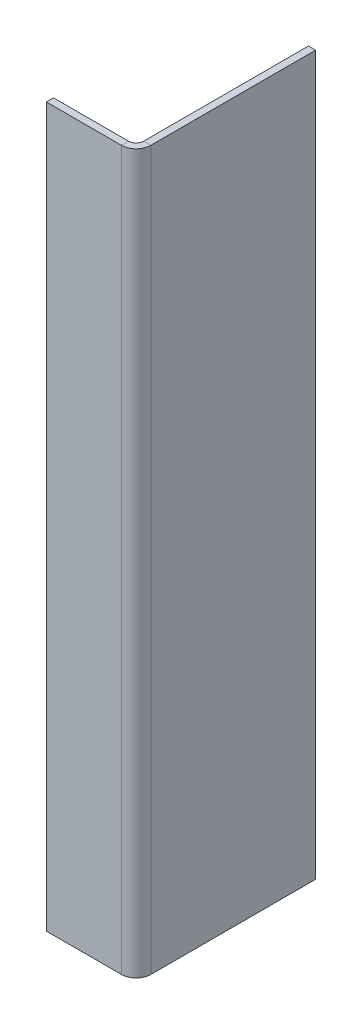
ISO-10303-21;
HEADER;
FILE_DESCRIPTION(('STEP AP214'),'2;1');
FILE_NAME('part.step','',(''),(''),'','','');
FILE_SCHEMA(('AUTOMOTIVE_DESIGN { 1 0 10303 214 1 1 1 1 }'));
ENDSEC;
DATA;
#1=APPLICATION_CONTEXT('core data for automotive mechanical design processes');
#2=APPLICATION_PROTOCOL_DEFINITION('international standard','automotive_design',2000,#1);
#3=PRODUCT_CONTEXT('',#1,'mechanical');
#4=PRODUCT('Part','Part','',(#3));
#5=PRODUCT_RELATED_PRODUCT_CATEGORY('part','',(#4));
#6=PRODUCT_DEFINITION_FORMATION('','',#4);
#7=PRODUCT_DEFINITION_CONTEXT('part definition',#1,'design');
#8=PRODUCT_DEFINITION('design','',#6,#7);
#9=PRODUCT_DEFINITION_SHAPE('','',#8);
#10=(LENGTH_UNIT() NAMED_UNIT(*) SI_UNIT(.MILLI.,.METRE.));
#11=(NAMED_UNIT(*) PLANE_ANGLE_UNIT() SI_UNIT($,.RADIAN.));
#12=(NAMED_UNIT(*) SI_UNIT($,.STERADIAN.) SOLID_ANGLE_UNIT());
#13=UNCERTAINTY_MEASURE_WITH_UNIT(LENGTH_MEASURE(1.E-05),#10,'distance_accuracy_value','');
#14=(GEOMETRIC_REPRESENTATION_CONTEXT(3) GLOBAL_UNCERTAINTY_ASSIGNED_CONTEXT((#13)) GLOBAL_UNIT_ASSIGNED_CONTEXT((#10,
#11,#12)) REPRESENTATION_CONTEXT('',''));
#15=CARTESIAN_POINT('',(0.,0.,0.));
#16=DIRECTION('',(0.,0.,1.));
#17=DIRECTION('',(1.,0.,0.));
#18=AXIS2_PLACEMENT_3D('',#15,#16,#17);
#19=CARTESIAN_POINT('',(-6.21284,152.4,38.1));
#20=DIRECTION('',(0.,1.,0.));
#21=DIRECTION('',(0.,0.,1.));
#22=AXIS2_PLACEMENT_3D('',#19,#20,#21);
#23=PLANE('',#22);
#24=DIRECTION('',(0.,0.,-1.));
#25=VECTOR('',#24,1.);
#26=CARTESIAN_POINT('',(-6.21284,152.4,38.1));
#27=LINE('',#26,#25);
#28=CARTESIAN_POINT('',(-6.21284,152.4,38.1));
#29=VERTEX_POINT('',#28);
#30=CARTESIAN_POINT('',(-6.21284,152.4,35.06216));
#31=VERTEX_POINT('',#30);
#32=EDGE_CURVE('E11',#29,#31,#27,.T.);
#33=ORIENTED_EDGE('',*,*,#32,.F.);
#34=CARTESIAN_POINT('',(-6.21284,152.4,31.88716));
#35=DIRECTION('',(0.,1.,0.));
#36=DIRECTION('',(0.,0.,1.));
#37=AXIS2_PLACEMENT_3D('',#34,#35,#36);
#38=CIRCLE('',#37,6.21284);
#39=CARTESIAN_POINT('',(0.,152.4,31.8871599999999));
#40=VERTEX_POINT('',#39);
#41=EDGE_CURVE('E136',#40,#29,#38,.F.);
#42=ORIENTED_EDGE('',*,*,#41,.F.);
#43=DIRECTION('',(1.,0.,0.));
#44=VECTOR('',#43,1.);
#45=CARTESIAN_POINT('',(-3.03784,152.4,31.88716));
#46=LINE('',#45,#44);
#47=CARTESIAN_POINT('',(-3.03784,152.4,31.88716));
#48=VERTEX_POINT('',#47);
#49=EDGE_CURVE('E47',#48,#40,#46,.T.);
#50=ORIENTED_EDGE('',*,*,#49,.F.);
#51=CARTESIAN_POINT('',(-6.21284,152.4,31.88716));
#52=DIRECTION('',(0.,1.,0.));
#53=DIRECTION('',(1.,0.,0.));
#54=AXIS2_PLACEMENT_3D('',#51,#52,#53);
#55=CIRCLE('',#54,3.175);
#56=EDGE_CURVE('E129',#48,#31,#55,.F.);
#57=ORIENTED_EDGE('',*,*,#56,.T.);
#58=EDGE_LOOP('',(#33,#42,#50,#57));
#59=FACE_BOUND('',#58,.T.);
#60=ADVANCED_FACE('F39',(#59),#23,.T.);
#61=CARTESIAN_POINT('',(-3.03784,152.4,31.88716));
#62=DIRECTION('',(0.,1.,0.));
#63=DIRECTION('',(0.,0.,1.));
#64=AXIS2_PLACEMENT_3D('',#61,#62,#63);
#65=PLANE('',#64);
#66=DIRECTION('',(-1.,0.,0.));
#67=VECTOR('',#66,1.);
#68=CARTESIAN_POINT('',(0.,152.4,38.1));
#69=LINE('',#68,#67);
#70=CARTESIAN_POINT('',(-38.1,152.4,38.1));
#71=VERTEX_POINT('',#70);
#72=EDGE_CURVE('E185',#29,#71,#69,.T.);
#73=ORIENTED_EDGE('',*,*,#72,.F.);
#74=ORIENTED_EDGE('',*,*,#32,.T.);
#75=DIRECTION('',(1.,0.,0.));
#76=VECTOR('',#75,1.);
#77=CARTESIAN_POINT('',(0.,152.4,35.06216));
#78=LINE('',#77,#76);
#79=CARTESIAN_POINT('',(-38.1,152.4,35.06216));
#80=VERTEX_POINT('',#79);
#81=EDGE_CURVE('E95',#31,#80,#78,.F.);
#82=ORIENTED_EDGE('',*,*,#81,.T.);
#83=DIRECTION('',(0.,0.,-1.));
#84=VECTOR('',#83,1.);
#85=CARTESIAN_POINT('',(-38.1,152.4,38.1));
#86=LINE('',#85,#84);
#87=EDGE_CURVE('E342',#71,#80,#86,.T.);
#88=ORIENTED_EDGE('',*,*,#87,.F.);
#89=EDGE_LOOP('',(#73,#74,#82,#88));
#90=FACE_BOUND('',#89,.T.);
#91=ADVANCED_FACE('F193',(#90),#65,.T.);
#92=CARTESIAN_POINT('',(0.,-152.4,31.8871599999999));
#93=DIRECTION('',(0.,-1.,0.));
#94=DIRECTION('',(0.,0.,-1.));
#95=AXIS2_PLACEMENT_3D('',#92,#93,#94);
#96=PLANE('',#95);
#97=DIRECTION('',(-1.,0.,0.));
#98=VECTOR('',#97,1.);
#99=CARTESIAN_POINT('',(0.,-152.4,31.8871599999999));
#100=LINE('',#99,#98);
#101=CARTESIAN_POINT('',(0.,-152.4,31.8871599999999));
#102=VERTEX_POINT('',#101);
#103=CARTESIAN_POINT('',(-3.03784,-152.4,31.88716));
#104=VERTEX_POINT('',#103);
#105=EDGE_CURVE('E82',#102,#104,#100,.T.);
#106=ORIENTED_EDGE('',*,*,#105,.F.);
#107=CARTESIAN_POINT('',(-6.21284,-152.4,31.88716));
#108=DIRECTION('',(0.,1.,0.));
#109=DIRECTION('',(0.,0.,1.));
#110=AXIS2_PLACEMENT_3D('',#107,#108,#109);
#111=CIRCLE('',#110,6.21284);
#112=CARTESIAN_POINT('',(-6.21284,-152.4,38.1));
#113=VERTEX_POINT('',#112);
#114=EDGE_CURVE('E151',#102,#113,#111,.F.);
#115=ORIENTED_EDGE('',*,*,#114,.T.);
#116=DIRECTION('',(0.,0.,1.));
#117=VECTOR('',#116,1.);
#118=CARTESIAN_POINT('',(-6.21284,-152.4,35.06216));
#119=LINE('',#118,#117);
#120=CARTESIAN_POINT('',(-6.21284,-152.4,35.06216));
#121=VERTEX_POINT('',#120);
#122=EDGE_CURVE('E89',#121,#113,#119,.T.);
#123=ORIENTED_EDGE('',*,*,#122,.F.);
#124=CARTESIAN_POINT('',(-6.21284,-152.4,31.88716));
#125=DIRECTION('',(0.,1.,0.));
#126=DIRECTION('',(1.,0.,0.));
#127=AXIS2_PLACEMENT_3D('',#124,#125,#126);
#128=CIRCLE('',#127,3.175);
#129=EDGE_CURVE('E158',#104,#121,#128,.F.);
#130=ORIENTED_EDGE('',*,*,#129,.F.);
#131=EDGE_LOOP('',(#106,#115,#123,#130));
#132=FACE_BOUND('',#131,.T.);
#133=ADVANCED_FACE('F191',(#132),#96,.T.);
#134=CARTESIAN_POINT('',(-6.21284,-152.4,35.06216));
#135=DIRECTION('',(0.,-1.,0.));
#136=DIRECTION('',(0.,0.,-1.));
#137=AXIS2_PLACEMENT_3D('',#134,#135,#136);
#138=PLANE('',#137);
#139=DIRECTION('',(0.,0.,1.));
#140=VECTOR('',#139,1.);
#141=CARTESIAN_POINT('',(0.,-152.4,-38.1));
#142=LINE('',#141,#140);
#143=CARTESIAN_POINT('',(0.,-152.4,-38.1));
#144=VERTEX_POINT('',#143);
#145=EDGE_CURVE('E153',#144,#102,#142,.T.);
#146=ORIENTED_EDGE('',*,*,#145,.T.);
#147=ORIENTED_EDGE('',*,*,#105,.T.);
#148=DIRECTION('',(0.,0.,-1.));
#149=VECTOR('',#148,1.);
#150=CARTESIAN_POINT('',(-3.03784,-152.4,-38.1));
#151=LINE('',#150,#149);
#152=CARTESIAN_POINT('',(-3.03784,-152.4,-38.1));
#153=VERTEX_POINT('',#152);
#154=EDGE_CURVE('E156',#153,#104,#151,.F.);
#155=ORIENTED_EDGE('',*,*,#154,.F.);
#156=DIRECTION('',(1.,0.,0.));
#157=VECTOR('',#156,1.);
#158=CARTESIAN_POINT('',(-3.03784,-152.4,-38.1));
#159=LINE('',#158,#157);
#160=EDGE_CURVE('E117',#153,#144,#159,.T.);
#161=ORIENTED_EDGE('',*,*,#160,.T.);
#162=EDGE_LOOP('',(#146,#147,#155,#161));
#163=FACE_BOUND('',#162,.T.);
#164=ADVANCED_FACE('F187',(#163),#138,.T.);
#165=CARTESIAN_POINT('',(0.,152.4,35.06216));
#166=DIRECTION('',(0.,0.,1.));
#167=DIRECTION('',(1.,0.,0.));
#168=AXIS2_PLACEMENT_3D('',#165,#166,#167);
#169=PLANE('',#168);
#170=DIRECTION('',(1.,0.,0.));
#171=VECTOR('',#170,1.);
#172=CARTESIAN_POINT('',(0.,-152.4,35.06216));
#173=LINE('',#172,#171);
#174=CARTESIAN_POINT('',(-38.1,-152.4,35.06216));
#175=VERTEX_POINT('',#174);
#176=EDGE_CURVE('E142',#121,#175,#173,.F.);
#177=ORIENTED_EDGE('',*,*,#176,.T.);
#178=DIRECTION('',(0.,-1.,0.));
#179=VECTOR('',#178,1.);
#180=CARTESIAN_POINT('',(-38.1,152.4,35.06216));
#181=LINE('',#180,#179);
#182=EDGE_CURVE('E172',#80,#175,#181,.T.);
#183=ORIENTED_EDGE('',*,*,#182,.F.);
#184=ORIENTED_EDGE('',*,*,#81,.F.);
#185=DIRECTION('',(0.,-1.,0.));
#186=VECTOR('',#185,1.);
#187=CARTESIAN_POINT('',(-6.21284,152.4,35.06216));
#188=LINE('',#187,#186);
#189=EDGE_CURVE('E141',#31,#121,#188,.T.);
#190=ORIENTED_EDGE('',*,*,#189,.T.);
#191=EDGE_LOOP('',(#177,#183,#184,#190));
#192=FACE_BOUND('',#191,.T.);
#193=ADVANCED_FACE('F199',(#192),#169,.F.);
#194=CARTESIAN_POINT('',(-38.1,152.4,38.1));
#195=DIRECTION('',(-1.,0.,0.));
#196=DIRECTION('',(0.,0.,1.));
#197=AXIS2_PLACEMENT_3D('',#194,#195,#196);
#198=PLANE('',#197);
#199=DIRECTION('',(0.,0.,-1.));
#200=VECTOR('',#199,1.);
#201=CARTESIAN_POINT('',(-38.1,-152.4,38.1));
#202=LINE('',#201,#200);
#203=CARTESIAN_POINT('',(-38.1,-152.4,38.1));
#204=VERTEX_POINT('',#203);
#205=EDGE_CURVE('E145',#204,#175,#202,.T.);
#206=ORIENTED_EDGE('',*,*,#205,.F.);
#207=DIRECTION('',(0.,-1.,0.));
#208=VECTOR('',#207,1.);
#209=CARTESIAN_POINT('',(-38.1,152.4,38.1));
#210=LINE('',#209,#208);
#211=EDGE_CURVE('E170',#71,#204,#210,.T.);
#212=ORIENTED_EDGE('',*,*,#211,.F.);
#213=ORIENTED_EDGE('',*,*,#87,.T.);
#214=ORIENTED_EDGE('',*,*,#182,.T.);
#215=EDGE_LOOP('',(#206,#212,#213,#214));
#216=FACE_BOUND('',#215,.T.);
#217=ADVANCED_FACE('F230',(#216),#198,.T.);
#218=CARTESIAN_POINT('',(0.,152.4,38.1));
#219=DIRECTION('',(0.,0.,1.));
#220=DIRECTION('',(1.,0.,0.));
#221=AXIS2_PLACEMENT_3D('',#218,#219,#220);
#222=PLANE('',#221);
#223=DIRECTION('',(-1.,0.,0.));
#224=VECTOR('',#223,1.);
#225=CARTESIAN_POINT('',(0.,-152.4,38.1));
#226=LINE('',#225,#224);
#227=EDGE_CURVE('E148',#113,#204,#226,.T.);
#228=ORIENTED_EDGE('',*,*,#227,.F.);
#229=DIRECTION('',(0.,-1.,0.));
#230=VECTOR('',#229,1.);
#231=CARTESIAN_POINT('',(-6.21284,152.4,38.1));
#232=LINE('',#231,#230);
#233=EDGE_CURVE('E167',#29,#113,#232,.T.);
#234=ORIENTED_EDGE('',*,*,#233,.F.);
#235=ORIENTED_EDGE('',*,*,#72,.T.);
#236=ORIENTED_EDGE('',*,*,#211,.T.);
#237=EDGE_LOOP('',(#228,#234,#235,#236));
#238=FACE_BOUND('',#237,.T.);
#239=ADVANCED_FACE('F241',(#238),#222,.T.);
#240=CARTESIAN_POINT('',(-6.21284,152.4,31.88716));
#241=DIRECTION('',(0.,-1.,0.));
#242=DIRECTION('',(0.,0.,-1.));
#243=AXIS2_PLACEMENT_3D('',#240,#241,#242);
#244=CYLINDRICAL_SURFACE('',#243,6.21284);
#245=ORIENTED_EDGE('',*,*,#114,.F.);
#246=DIRECTION('',(0.,-1.,0.));
#247=VECTOR('',#246,1.);
#248=CARTESIAN_POINT('',(0.,152.4,31.8871599999999));
#249=LINE('',#248,#247);
#250=EDGE_CURVE('E164',#40,#102,#249,.T.);
#251=ORIENTED_EDGE('',*,*,#250,.F.);
#252=ORIENTED_EDGE('',*,*,#41,.T.);
#253=ORIENTED_EDGE('',*,*,#233,.T.);
#254=EDGE_LOOP('',(#245,#251,#252,#253));
#255=FACE_BOUND('',#254,.T.);
#256=ADVANCED_FACE('F181',(#255),#244,.T.);
#257=CARTESIAN_POINT('',(0.,152.4,-38.1));
#258=DIRECTION('',(1.,0.,0.));
#259=DIRECTION('',(0.,0.,-1.));
#260=AXIS2_PLACEMENT_3D('',#257,#258,#259);
#261=PLANE('',#260);
#262=ORIENTED_EDGE('',*,*,#145,.F.);
#263=DIRECTION('',(0.,-1.,0.));
#264=VECTOR('',#263,1.);
#265=CARTESIAN_POINT('',(0.,152.4,-38.1));
#266=LINE('',#265,#264);
#267=CARTESIAN_POINT('',(0.,152.4,-38.1));
#268=VERTEX_POINT('',#267);
#269=EDGE_CURVE('E119',#268,#144,#266,.T.);
#270=ORIENTED_EDGE('',*,*,#269,.F.);
#271=DIRECTION('',(0.,0.,1.));
#272=VECTOR('',#271,1.);
#273=CARTESIAN_POINT('',(0.,152.4,-38.1));
#274=LINE('',#273,#272);
#275=EDGE_CURVE('E134',#268,#40,#274,.T.);
#276=ORIENTED_EDGE('',*,*,#275,.T.);
#277=ORIENTED_EDGE('',*,*,#250,.T.);
#278=EDGE_LOOP('',(#262,#270,#276,#277));
#279=FACE_BOUND('',#278,.T.);
#280=ADVANCED_FACE('F186',(#279),#261,.T.);
#281=CARTESIAN_POINT('',(-3.03784,152.4,-38.1));
#282=DIRECTION('',(0.,0.,-1.));
#283=DIRECTION('',(-1.,0.,0.));
#284=AXIS2_PLACEMENT_3D('',#281,#282,#283);
#285=PLANE('',#284);
#286=ORIENTED_EDGE('',*,*,#160,.F.);
#287=DIRECTION('',(0.,-1.,0.));
#288=VECTOR('',#287,1.);
#289=CARTESIAN_POINT('',(-3.03784,152.4,-38.1));
#290=LINE('',#289,#288);
#291=CARTESIAN_POINT('',(-3.03784,152.4,-38.1));
#292=VERTEX_POINT('',#291);
#293=EDGE_CURVE('E111',#292,#153,#290,.T.);
#294=ORIENTED_EDGE('',*,*,#293,.F.);
#295=DIRECTION('',(1.,0.,0.));
#296=VECTOR('',#295,1.);
#297=CARTESIAN_POINT('',(-3.03784,152.4,-38.1));
#298=LINE('',#297,#296);
#299=EDGE_CURVE('E115',#292,#268,#298,.T.);
#300=ORIENTED_EDGE('',*,*,#299,.T.);
#301=ORIENTED_EDGE('',*,*,#269,.T.);
#302=EDGE_LOOP('',(#286,#294,#300,#301));
#303=FACE_BOUND('',#302,.T.);
#304=ADVANCED_FACE('F113',(#303),#285,.T.);
#305=CARTESIAN_POINT('',(-3.03784,152.4,-38.1));
#306=DIRECTION('',(1.,0.,0.));
#307=DIRECTION('',(0.,0.,-1.));
#308=AXIS2_PLACEMENT_3D('',#305,#306,#307);
#309=PLANE('',#308);
#310=ORIENTED_EDGE('',*,*,#154,.T.);
#311=DIRECTION('',(0.,-1.,0.));
#312=VECTOR('',#311,1.);
#313=CARTESIAN_POINT('',(-3.03784,152.4,31.88716));
#314=LINE('',#313,#312);
#315=EDGE_CURVE('E120',#48,#104,#314,.T.);
#316=ORIENTED_EDGE('',*,*,#315,.F.);
#317=DIRECTION('',(0.,0.,-1.));
#318=VECTOR('',#317,1.);
#319=CARTESIAN_POINT('',(-3.03784,152.4,-38.1));
#320=LINE('',#319,#318);
#321=EDGE_CURVE('E124',#292,#48,#320,.F.);
#322=ORIENTED_EDGE('',*,*,#321,.F.);
#323=ORIENTED_EDGE('',*,*,#293,.T.);
#324=EDGE_LOOP('',(#310,#316,#322,#323));
#325=FACE_BOUND('',#324,.T.);
#326=ADVANCED_FACE('F125',(#325),#309,.F.);
#327=CARTESIAN_POINT('',(-6.21284,152.4,31.88716));
#328=DIRECTION('',(0.,-1.,0.));
#329=DIRECTION('',(0.,0.,-1.));
#330=AXIS2_PLACEMENT_3D('',#327,#328,#329);
#331=CYLINDRICAL_SURFACE('',#330,3.175);
#332=ORIENTED_EDGE('',*,*,#129,.T.);
#333=ORIENTED_EDGE('',*,*,#189,.F.);
#334=ORIENTED_EDGE('',*,*,#56,.F.);
#335=ORIENTED_EDGE('',*,*,#315,.T.);
#336=EDGE_LOOP('',(#332,#333,#334,#335));
#337=FACE_BOUND('',#336,.T.);
#338=ADVANCED_FACE('F189',(#337),#331,.F.);
#339=CARTESIAN_POINT('',(-6.21284,152.4,31.88716));
#340=DIRECTION('',(0.,1.,0.));
#341=DIRECTION('',(1.,0.,0.));
#342=AXIS2_PLACEMENT_3D('',#339,#340,#341);
#343=PLANE('',#342);
#344=ORIENTED_EDGE('',*,*,#321,.T.);
#345=ORIENTED_EDGE('',*,*,#49,.T.);
#346=ORIENTED_EDGE('',*,*,#275,.F.);
#347=ORIENTED_EDGE('',*,*,#299,.F.);
#348=EDGE_LOOP('',(#344,#345,#346,#347));
#349=FACE_BOUND('',#348,.T.);
#350=ADVANCED_FACE('F132',(#349),#343,.T.);
#351=CARTESIAN_POINT('',(-6.21284,-152.4,31.88716));
#352=DIRECTION('',(0.,1.,0.));
#353=DIRECTION('',(1.,0.,0.));
#354=AXIS2_PLACEMENT_3D('',#351,#352,#353);
#355=PLANE('',#354);
#356=ORIENTED_EDGE('',*,*,#176,.F.);
#357=ORIENTED_EDGE('',*,*,#122,.T.);
#358=ORIENTED_EDGE('',*,*,#227,.T.);
#359=ORIENTED_EDGE('',*,*,#205,.T.);
#360=EDGE_LOOP('',(#356,#357,#358,#359));
#361=FACE_BOUND('',#360,.T.);
#362=ADVANCED_FACE('F307',(#361),#355,.F.);
#363=CLOSED_SHELL('',(#60,#91,#133,#164,#193,#217,#239,#256,#280,#304,#326,#338,#350,#362));
#364=MANIFOLD_SOLID_BREP('B2',#363);
#365=ADVANCED_BREP_SHAPE_REPRESENTATION('',(#18,#364),#14);
#366=SHAPE_DEFINITION_REPRESENTATION(#9,#365);
ENDSEC;
END-ISO-10303-21;
